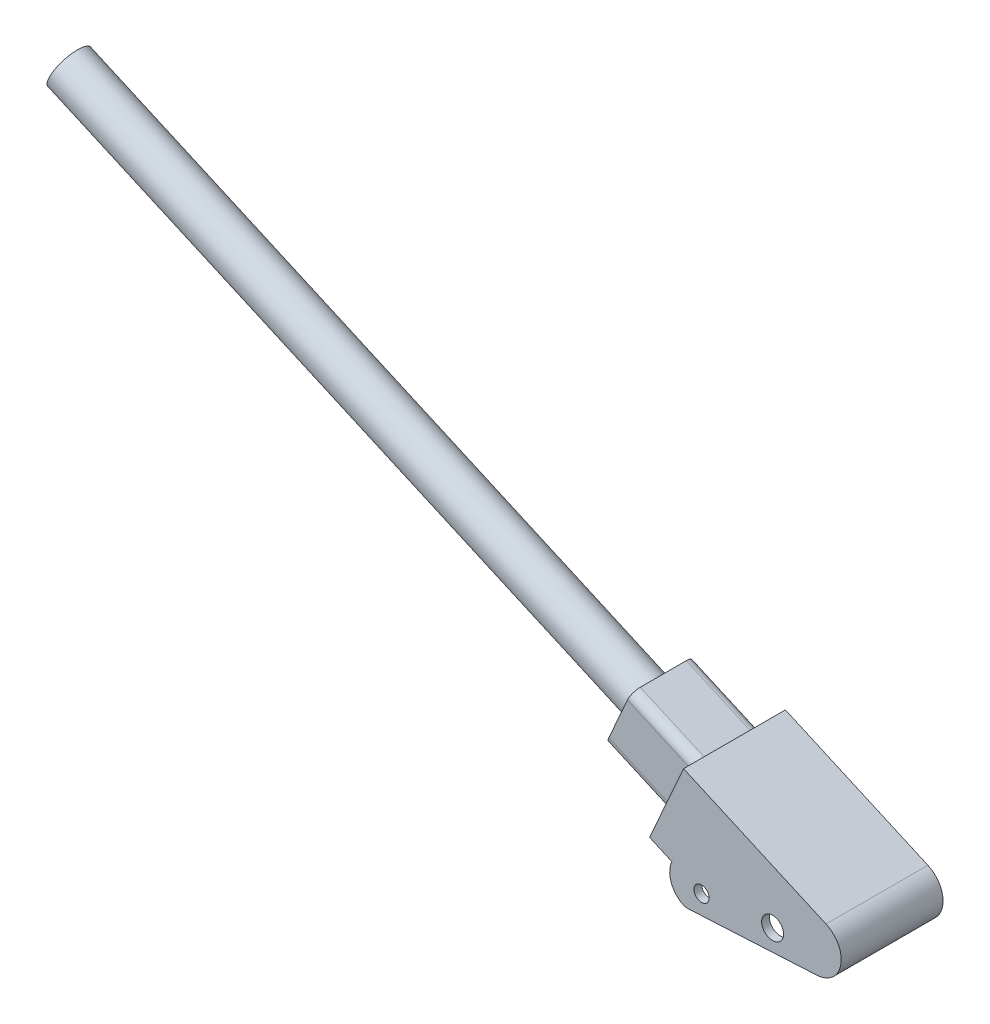
ISO-10303-21;
HEADER;
FILE_DESCRIPTION(('STEP AP214'),'2;1');
FILE_NAME('part.step','',(''),(''),'','','');
FILE_SCHEMA(('AUTOMOTIVE_DESIGN { 1 0 10303 214 1 1 1 1 }'));
ENDSEC;
DATA;
#1=APPLICATION_CONTEXT('core data for automotive mechanical design processes');
#2=APPLICATION_PROTOCOL_DEFINITION('international standard','automotive_design',2000,#1);
#3=PRODUCT_CONTEXT('',#1,'mechanical');
#4=PRODUCT('Part','Part','',(#3));
#5=PRODUCT_RELATED_PRODUCT_CATEGORY('part','',(#4));
#6=PRODUCT_DEFINITION_FORMATION('','',#4);
#7=PRODUCT_DEFINITION_CONTEXT('part definition',#1,'design');
#8=PRODUCT_DEFINITION('design','',#6,#7);
#9=PRODUCT_DEFINITION_SHAPE('','',#8);
#10=(LENGTH_UNIT() NAMED_UNIT(*) SI_UNIT(.MILLI.,.METRE.));
#11=(NAMED_UNIT(*) PLANE_ANGLE_UNIT() SI_UNIT($,.RADIAN.));
#12=(NAMED_UNIT(*) SI_UNIT($,.STERADIAN.) SOLID_ANGLE_UNIT());
#13=UNCERTAINTY_MEASURE_WITH_UNIT(LENGTH_MEASURE(1.E-05),#10,'distance_accuracy_value','');
#14=(GEOMETRIC_REPRESENTATION_CONTEXT(3) GLOBAL_UNCERTAINTY_ASSIGNED_CONTEXT((#13)) GLOBAL_UNIT_ASSIGNED_CONTEXT((#10,
#11,#12)) REPRESENTATION_CONTEXT('',''));
#15=CARTESIAN_POINT('',(0.,0.,0.));
#16=DIRECTION('',(0.,0.,1.));
#17=DIRECTION('',(1.,0.,0.));
#18=AXIS2_PLACEMENT_3D('',#15,#16,#17);
#19=CARTESIAN_POINT('',(-9.01965336816144,699.895781687176,-65.3737294305814));
#20=DIRECTION('',(0.406135243581549,0.913812980823186,0.));
#21=DIRECTION('',(-0.913812980823186,0.406135243581549,0.));
#22=AXIS2_PLACEMENT_3D('',#19,#20,#21);
#23=PLANE('',#22);
#24=DIRECTION('',(0.,0.,1.));
#25=VECTOR('',#24,1.);
#26=CARTESIAN_POINT('',(-9.01965336816149,699.895781687176,-65.3737294305814));
#27=LINE('',#26,#25);
#28=CARTESIAN_POINT('',(-9.01965336816179,699.895781687176,-5.42685815199663));
#29=VERTEX_POINT('',#28);
#30=CARTESIAN_POINT('',(-9.01965336816146,699.895781687176,-65.3737294305813));
#31=VERTEX_POINT('',#30);
#32=EDGE_CURVE('E170',#29,#31,#27,.F.);
#33=ORIENTED_EDGE('',*,*,#32,.T.);
#34=DIRECTION('',(0.913812980823186,-0.406135243581549,0.));
#35=VECTOR('',#34,1.);
#36=CARTESIAN_POINT('',(-9.01965336816144,699.895781687176,-65.3737294305813));
#37=LINE('',#36,#35);
#38=CARTESIAN_POINT('',(83.8038964876455,658.641262631392,-65.3737294305807));
#39=VERTEX_POINT('',#38);
#40=EDGE_CURVE('E306',#31,#39,#37,.T.);
#41=ORIENTED_EDGE('',*,*,#40,.T.);
#42=DIRECTION('',(0.,0.,1.));
#43=VECTOR('',#42,1.);
#44=CARTESIAN_POINT('',(83.8038964876453,658.641262631392,-65.3737294305807));
#45=LINE('',#44,#43);
#46=CARTESIAN_POINT('',(83.8038964876451,658.641262631392,-5.42685815199609));
#47=VERTEX_POINT('',#46);
#48=EDGE_CURVE('E162',#39,#47,#45,.T.);
#49=ORIENTED_EDGE('',*,*,#48,.T.);
#50=DIRECTION('',(0.913812980823186,-0.406135243581549,0.));
#51=VECTOR('',#50,1.);
#52=CARTESIAN_POINT('',(-9.01965336816178,699.895781687176,-5.42685815199661));
#53=LINE('',#52,#51);
#54=EDGE_CURVE('E182',#29,#47,#53,.T.);
#55=ORIENTED_EDGE('',*,*,#54,.F.);
#56=EDGE_LOOP('',(#33,#41,#49,#55));
#57=FACE_BOUND('',#56,.T.);
#58=ADVANCED_FACE('F17',(#57),#23,.F.);
#59=CARTESIAN_POINT('',(79.3680873572479,648.660597254841,-65.3737294305807));
#60=DIRECTION('',(0.,0.,1.));
#61=DIRECTION('',(1.,0.,0.));
#62=AXIS2_PLACEMENT_3D('',#59,#60,#61);
#63=CYLINDRICAL_SURFACE('',#62,10.9220000000002);
#64=ORIENTED_EDGE('',*,*,#48,.F.);
#65=CARTESIAN_POINT('',(79.3680873572479,648.660597254841,-65.3737294305808));
#66=DIRECTION('',(0.,0.,1.));
#67=DIRECTION('',(1.,0.,0.));
#68=AXIS2_PLACEMENT_3D('',#65,#66,#67);
#69=CIRCLE('',#68,10.9220000000002);
#70=CARTESIAN_POINT('',(90.2900873572481,648.660597254841,-65.3737294305807));
#71=VERTEX_POINT('',#70);
#72=EDGE_CURVE('E303',#39,#71,#69,.F.);
#73=ORIENTED_EDGE('',*,*,#72,.T.);
#74=DIRECTION('',(0.,0.,1.));
#75=VECTOR('',#74,1.);
#76=CARTESIAN_POINT('',(90.2900873572481,648.660597254841,-65.3737294305807));
#77=LINE('',#76,#75);
#78=CARTESIAN_POINT('',(90.2900873572479,648.660597254841,-5.42685815199604));
#79=VERTEX_POINT('',#78);
#80=EDGE_CURVE('E179',#71,#79,#77,.T.);
#81=ORIENTED_EDGE('',*,*,#80,.T.);
#82=CARTESIAN_POINT('',(79.3680873572475,648.660597254841,-5.42685815199611));
#83=DIRECTION('',(0.,0.,1.));
#84=DIRECTION('',(1.,0.,0.));
#85=AXIS2_PLACEMENT_3D('',#82,#83,#84);
#86=CIRCLE('',#85,10.9220000000002);
#87=EDGE_CURVE('E20',#47,#79,#86,.F.);
#88=ORIENTED_EDGE('',*,*,#87,.F.);
#89=EDGE_LOOP('',(#64,#73,#81,#88));
#90=FACE_BOUND('',#89,.T.);
#91=ADVANCED_FACE('F714',(#90),#63,.F.);
#92=CARTESIAN_POINT('',(-27.0950140159009,659.225833796656,-65.3737294305814));
#93=DIRECTION('',(-0.913812980823186,0.406135243581548,0.));
#94=DIRECTION('',(-0.406135243581548,-0.913812980823186,0.));
#95=AXIS2_PLACEMENT_3D('',#92,#93,#94);
#96=PLANE('',#95);
#97=DIRECTION('',(0.,0.,1.));
#98=VECTOR('',#97,1.);
#99=CARTESIAN_POINT('',(-27.0950140159009,659.225833796657,-65.3737294305814));
#100=LINE('',#99,#98);
#101=CARTESIAN_POINT('',(-27.0950140159013,659.225833796657,-5.42685815199659));
#102=VERTEX_POINT('',#101);
#103=CARTESIAN_POINT('',(-27.0950140159009,659.225833796657,-65.3737294305814));
#104=VERTEX_POINT('',#103);
#105=EDGE_CURVE('E329',#102,#104,#100,.F.);
#106=ORIENTED_EDGE('',*,*,#105,.T.);
#107=DIRECTION('',(0.406135243581548,0.913812980823186,0.));
#108=VECTOR('',#107,1.);
#109=CARTESIAN_POINT('',(-27.0950140159009,659.225833796656,-65.3737294305814));
#110=LINE('',#109,#108);
#111=EDGE_CURVE('E177',#104,#31,#110,.T.);
#112=ORIENTED_EDGE('',*,*,#111,.T.);
#113=ORIENTED_EDGE('',*,*,#32,.F.);
#114=DIRECTION('',(0.406135243581549,0.913812980823186,0.));
#115=VECTOR('',#114,1.);
#116=CARTESIAN_POINT('',(-27.0950140159013,659.225833796657,-5.4268581519967));
#117=LINE('',#116,#115);
#118=EDGE_CURVE('E174',#102,#29,#117,.T.);
#119=ORIENTED_EDGE('',*,*,#118,.F.);
#120=EDGE_LOOP('',(#106,#112,#113,#119));
#121=FACE_BOUND('',#120,.T.);
#122=ADVANCED_FACE('F172',(#121),#96,.F.);
#123=CARTESIAN_POINT('',(90.2900873572481,648.660597254841,-65.3737294305807));
#124=DIRECTION('',(1.,0.,0.));
#125=DIRECTION('',(0.,1.,0.));
#126=AXIS2_PLACEMENT_3D('',#123,#124,#125);
#127=PLANE('',#126);
#128=DIRECTION('',(0.,1.,0.));
#129=VECTOR('',#128,1.);
#130=CARTESIAN_POINT('',(90.2900873572478,649.836695259532,-5.42685815199597));
#131=LINE('',#130,#129);
#132=CARTESIAN_POINT('',(90.2900873572478,632.707669362922,-5.42685815199599));
#133=VERTEX_POINT('',#132);
#134=EDGE_CURVE('E315',#79,#133,#131,.F.);
#135=ORIENTED_EDGE('',*,*,#134,.F.);
#136=ORIENTED_EDGE('',*,*,#80,.F.);
#137=DIRECTION('',(0.,1.,0.));
#138=VECTOR('',#137,1.);
#139=CARTESIAN_POINT('',(90.2900873572481,649.836695259532,-65.3737294305807));
#140=LINE('',#139,#138);
#141=CARTESIAN_POINT('',(90.2900873572481,632.707669362922,-65.3737294305807));
#142=VERTEX_POINT('',#141);
#143=EDGE_CURVE('E305',#71,#142,#140,.F.);
#144=ORIENTED_EDGE('',*,*,#143,.T.);
#145=DIRECTION('',(0.,0.,-1.));
#146=VECTOR('',#145,1.);
#147=CARTESIAN_POINT('',(90.2900873572477,632.707669362922,5.89659792091371E-13));
#148=LINE('',#147,#146);
#149=EDGE_CURVE('E278',#133,#142,#148,.T.);
#150=ORIENTED_EDGE('',*,*,#149,.F.);
#151=EDGE_LOOP('',(#135,#136,#144,#150));
#152=FACE_BOUND('',#151,.T.);
#153=ADVANCED_FACE('F700',(#152),#127,.F.);
#154=CARTESIAN_POINT('',(0.,637.971544662078,0.));
#155=DIRECTION('',(0.,0.,-1.));
#156=DIRECTION('',(0.,1.,0.));
#157=AXIS2_PLACEMENT_3D('',#154,#155,#156);
#158=CYLINDRICAL_SURFACE('',#157,5.29336);
#159=CARTESIAN_POINT('',(0.,637.971544662078,-65.3737294305811));
#160=DIRECTION('',(0.,0.,-1.));
#161=DIRECTION('',(0.,1.,0.));
#162=AXIS2_PLACEMENT_3D('',#159,#160,#161);
#163=CIRCLE('',#162,5.29336);
#164=CARTESIAN_POINT('',(0.,643.264904662078,-65.3737294305811));
#165=VERTEX_POINT('',#164);
#166=EDGE_CURVE('E309',#165,#165,#163,.F.);
#167=ORIENTED_EDGE('',*,*,#166,.T.);
#168=EDGE_LOOP('',(#167));
#169=FACE_BOUND('',#168,.T.);
#170=CARTESIAN_POINT('',(0.,637.971544662078,-70.8005875825771));
#171=DIRECTION('',(0.,0.,-1.));
#172=DIRECTION('',(0.,1.,0.));
#173=AXIS2_PLACEMENT_3D('',#170,#171,#172);
#174=CIRCLE('',#173,5.29336);
#175=CARTESIAN_POINT('',(0.,643.264904662078,-70.8005875825771));
#176=VERTEX_POINT('',#175);
#177=EDGE_CURVE('E270',#176,#176,#174,.F.);
#178=ORIENTED_EDGE('',*,*,#177,.F.);
#179=EDGE_LOOP('',(#178));
#180=FACE_BOUND('',#179,.T.);
#181=ADVANCED_FACE('F692',(#169,#180),#158,.F.);
#182=CARTESIAN_POINT('',(49.4036598950758,642.072940425581,1.44382283906452E-12));
#183=DIRECTION('',(0.,0.,-1.));
#184=DIRECTION('',(-1.,0.,0.));
#185=AXIS2_PLACEMENT_3D('',#182,#183,#184);
#186=CYLINDRICAL_SURFACE('',#185,7.62);
#187=CARTESIAN_POINT('',(49.4036598950766,642.072940425581,-70.8005875825767));
#188=DIRECTION('',(0.,0.,-1.));
#189=DIRECTION('',(-1.,0.,0.));
#190=AXIS2_PLACEMENT_3D('',#187,#188,#189);
#191=CIRCLE('',#190,7.62);
#192=CARTESIAN_POINT('',(41.7836598950766,642.072940425581,-70.8005875825768));
#193=VERTEX_POINT('',#192);
#194=EDGE_CURVE('E267',#193,#193,#191,.F.);
#195=ORIENTED_EDGE('',*,*,#194,.F.);
#196=EDGE_LOOP('',(#195));
#197=FACE_BOUND('',#196,.T.);
#198=CARTESIAN_POINT('',(49.4036598950766,642.072940425581,-65.3737294305808));
#199=DIRECTION('',(0.,0.,-1.));
#200=DIRECTION('',(-1.,0.,0.));
#201=AXIS2_PLACEMENT_3D('',#198,#199,#200);
#202=CIRCLE('',#201,7.62);
#203=CARTESIAN_POINT('',(41.7836598950766,642.072940425581,-65.3737294305809));
#204=VERTEX_POINT('',#203);
#205=EDGE_CURVE('E307',#204,#204,#202,.F.);
#206=ORIENTED_EDGE('',*,*,#205,.T.);
#207=EDGE_LOOP('',(#206));
#208=FACE_BOUND('',#207,.T.);
#209=ADVANCED_FACE('F684',(#197,#208),#186,.F.);
#210=CARTESIAN_POINT('',(-9.91445800618713,630.578591642313,0.));
#211=DIRECTION('',(0.,0.,-1.));
#212=DIRECTION('',(-1.,0.,0.));
#213=AXIS2_PLACEMENT_3D('',#210,#211,#212);
#214=CYLINDRICAL_SURFACE('',#213,6.35000000000014);
#215=CARTESIAN_POINT('',(-9.91445800618671,630.578591642313,-70.8005875825774));
#216=DIRECTION('',(0.,0.,-1.));
#217=DIRECTION('',(-1.,0.,0.));
#218=AXIS2_PLACEMENT_3D('',#215,#216,#217);
#219=CIRCLE('',#218,6.35000000000014);
#220=CARTESIAN_POINT('',(-9.57971854778704,624.237420654633,-70.8005875825774));
#221=VERTEX_POINT('',#220);
#222=CARTESIAN_POINT('',(-12.6938613326272,624.869176860658,-70.8005875825774));
#223=VERTEX_POINT('',#222);
#224=EDGE_CURVE('E264',#221,#223,#219,.T.);
#225=ORIENTED_EDGE('',*,*,#224,.F.);
#226=DIRECTION('',(0.,0.,1.));
#227=VECTOR('',#226,1.);
#228=CARTESIAN_POINT('',(-9.57971854778699,624.237420654633,0.));
#229=LINE('',#228,#227);
#230=CARTESIAN_POINT('',(-9.57971854778705,624.237420654633,-65.3737294305813));
#231=VERTEX_POINT('',#230);
#232=EDGE_CURVE('E192',#231,#221,#229,.F.);
#233=ORIENTED_EDGE('',*,*,#232,.F.);
#234=CARTESIAN_POINT('',(-9.91445800618675,630.578591642313,-65.3737294305814));
#235=DIRECTION('',(0.,0.,-1.));
#236=DIRECTION('',(-1.,0.,0.));
#237=AXIS2_PLACEMENT_3D('',#234,#235,#236);
#238=CIRCLE('',#237,6.35000000000014);
#239=CARTESIAN_POINT('',(-12.6938613326272,624.869176860658,-65.3737294305814));
#240=VERTEX_POINT('',#239);
#241=EDGE_CURVE('E300',#231,#240,#238,.T.);
#242=ORIENTED_EDGE('',*,*,#241,.T.);
#243=DIRECTION('',(0.,0.,-1.));
#244=VECTOR('',#243,1.);
#245=CARTESIAN_POINT('',(-12.6938613326275,624.869176860658,0.));
#246=LINE('',#245,#244);
#247=EDGE_CURVE('E311',#223,#240,#246,.F.);
#248=ORIENTED_EDGE('',*,*,#247,.F.);
#249=EDGE_LOOP('',(#225,#233,#242,#248));
#250=FACE_BOUND('',#249,.T.);
#251=ADVANCED_FACE('F676',(#250),#214,.T.);
#252=CARTESIAN_POINT('',(-9.57971854778742,624.237420654633,0.));
#253=DIRECTION('',(0.052714875338522,-0.998609604359003,0.));
#254=DIRECTION('',(0.998609604359003,0.052714875338522,0.));
#255=AXIS2_PLACEMENT_3D('',#252,#253,#254);
#256=PLANE('',#255);
#257=DIRECTION('',(-0.998609604359003,-0.0527148753385221,0.));
#258=VECTOR('',#257,1.);
#259=CARTESIAN_POINT('',(80.3053578407677,628.982298508734,-70.8005875825768));
#260=LINE('',#259,#258);
#261=CARTESIAN_POINT('',(80.3053578407673,628.982298508734,-70.8005875825767));
#262=VERTEX_POINT('',#261);
#263=EDGE_CURVE('E261',#262,#221,#260,.T.);
#264=ORIENTED_EDGE('',*,*,#263,.F.);
#265=DIRECTION('',(0.,0.,-1.));
#266=VECTOR('',#265,1.);
#267=CARTESIAN_POINT('',(80.3053578407672,628.982298508734,5.26075361945318E-13));
#268=LINE('',#267,#266);
#269=CARTESIAN_POINT('',(80.3053578407672,628.982298508734,-65.3737294305808));
#270=VERTEX_POINT('',#269);
#271=EDGE_CURVE('E277',#270,#262,#268,.T.);
#272=ORIENTED_EDGE('',*,*,#271,.F.);
#273=DIRECTION('',(-0.998609604359003,-0.0527148753385221,0.));
#274=VECTOR('',#273,1.);
#275=CARTESIAN_POINT('',(80.3053578407676,628.982298508734,-65.3737294305807));
#276=LINE('',#275,#274);
#277=EDGE_CURVE('E302',#270,#231,#276,.T.);
#278=ORIENTED_EDGE('',*,*,#277,.T.);
#279=ORIENTED_EDGE('',*,*,#232,.T.);
#280=EDGE_LOOP('',(#264,#272,#278,#279));
#281=FACE_BOUND('',#280,.T.);
#282=ADVANCED_FACE('F669',(#281),#256,.T.);
#283=CARTESIAN_POINT('',(27.1453865764344,649.836695259532,-5.42685815199636));
#284=DIRECTION('',(0.,0.,-1.));
#285=DIRECTION('',(-1.,0.,0.));
#286=AXIS2_PLACEMENT_3D('',#283,#284,#285);
#287=PLANE('',#286);
#288=CARTESIAN_POINT('',(-9.9144580061871,630.578591642313,-5.42685815199661));
#289=DIRECTION('',(0.,0.,-1.));
#290=DIRECTION('',(-1.,0.,0.));
#291=AXIS2_PLACEMENT_3D('',#288,#289,#290);
#292=CIRCLE('',#291,6.35000000000014);
#293=CARTESIAN_POINT('',(-12.6938613326276,624.869176860658,-5.42685815199663));
#294=VERTEX_POINT('',#293);
#295=CARTESIAN_POINT('',(-9.57971854778745,624.237420654633,-5.42685815199658));
#296=VERTEX_POINT('',#295);
#297=EDGE_CURVE('E287',#294,#296,#292,.F.);
#298=ORIENTED_EDGE('',*,*,#297,.F.);
#299=CARTESIAN_POINT('',(-5.34579691209369,639.963476856648,-5.42685815199655));
#300=DIRECTION('',(0.,0.,-1.));
#301=DIRECTION('',(-1.,0.,0.));
#302=AXIS2_PLACEMENT_3D('',#299,#300,#301);
#303=CIRCLE('',#302,16.7878510565602);
#304=CARTESIAN_POINT('',(-20.623650860062,646.92186185906,-5.42685815199659));
#305=VERTEX_POINT('',#304);
#306=EDGE_CURVE('E283',#305,#294,#303,.F.);
#307=ORIENTED_EDGE('',*,*,#306,.F.);
#308=DIRECTION('',(0.913812980823184,-0.406135243581552,0.));
#309=VECTOR('',#308,1.);
#310=CARTESIAN_POINT('',(-36.1472189388689,653.821159894049,-5.42685815199654));
#311=LINE('',#310,#309);
#312=CARTESIAN_POINT('',(-27.0950140159011,649.797995933271,-5.42685815199654));
#313=VERTEX_POINT('',#312);
#314=EDGE_CURVE('E340',#313,#305,#311,.T.);
#315=ORIENTED_EDGE('',*,*,#314,.F.);
#316=DIRECTION('',(0.,1.,0.));
#317=VECTOR('',#316,1.);
#318=CARTESIAN_POINT('',(-27.0950140159011,619.887550238499,-5.42685815199654));
#319=LINE('',#318,#317);
#320=EDGE_CURVE('E190',#313,#102,#319,.T.);
#321=ORIENTED_EDGE('',*,*,#320,.T.);
#322=ORIENTED_EDGE('',*,*,#118,.T.);
#323=ORIENTED_EDGE('',*,*,#54,.T.);
#324=ORIENTED_EDGE('',*,*,#87,.T.);
#325=ORIENTED_EDGE('',*,*,#134,.T.);
#326=CARTESIAN_POINT('',(79.3680873572476,646.737577274238,-5.42685815199608));
#327=DIRECTION('',(0.,0.,-1.));
#328=DIRECTION('',(-1.,0.,0.));
#329=AXIS2_PLACEMENT_3D('',#326,#327,#328);
#330=CIRCLE('',#329,17.7800000000002);
#331=CARTESIAN_POINT('',(80.3053578407669,628.982298508734,-5.42685815199632));
#332=VERTEX_POINT('',#331);
#333=EDGE_CURVE('E279',#332,#133,#330,.F.);
#334=ORIENTED_EDGE('',*,*,#333,.F.);
#335=DIRECTION('',(0.998609604359003,0.052714875338522,0.));
#336=VECTOR('',#335,1.);
#337=CARTESIAN_POINT('',(-9.57971854778742,624.237420654633,-5.42685815199654));
#338=LINE('',#337,#336);
#339=EDGE_CURVE('E290',#296,#332,#338,.T.);
#340=ORIENTED_EDGE('',*,*,#339,.F.);
#341=EDGE_LOOP('',(#298,#307,#315,#321,#322,#323,#324,#325,#334,#340));
#342=FACE_BOUND('',#341,.T.);
#343=CARTESIAN_POINT('',(49.4036598950758,642.072940425581,-5.42685815199609));
#344=DIRECTION('',(0.,0.,-1.));
#345=DIRECTION('',(-1.,0.,0.));
#346=AXIS2_PLACEMENT_3D('',#343,#344,#345);
#347=CIRCLE('',#346,7.62);
#348=CARTESIAN_POINT('',(41.7836598950758,642.072940425581,-5.42685815199619));
#349=VERTEX_POINT('',#348);
#350=EDGE_CURVE('E291',#349,#349,#347,.F.);
#351=ORIENTED_EDGE('',*,*,#350,.T.);
#352=EDGE_LOOP('',(#351));
#353=FACE_BOUND('',#352,.T.);
#354=CARTESIAN_POINT('',(0.,637.971544662078,-5.42685815199636));
#355=DIRECTION('',(0.,0.,-1.));
#356=DIRECTION('',(0.,1.,0.));
#357=AXIS2_PLACEMENT_3D('',#354,#355,#356);
#358=CIRCLE('',#357,5.29336);
#359=CARTESIAN_POINT('',(0.,643.264904662078,-5.42685815199636));
#360=VERTEX_POINT('',#359);
#361=EDGE_CURVE('E294',#360,#360,#358,.F.);
#362=ORIENTED_EDGE('',*,*,#361,.T.);
#363=EDGE_LOOP('',(#362));
#364=FACE_BOUND('',#363,.T.);
#365=ADVANCED_FACE('F186',(#342,#353,#364),#287,.T.);
#366=CARTESIAN_POINT('',(-5.34579691209372,639.963476856648,0.));
#367=DIRECTION('',(0.,0.,-1.));
#368=DIRECTION('',(-1.,0.,0.));
#369=AXIS2_PLACEMENT_3D('',#366,#367,#368);
#370=CYLINDRICAL_SURFACE('',#369,16.7878510565602);
#371=CARTESIAN_POINT('',(-5.3457969120933,639.963476856648,-70.8005875825774));
#372=DIRECTION('',(0.,0.,-1.));
#373=DIRECTION('',(-1.,0.,0.));
#374=AXIS2_PLACEMENT_3D('',#371,#372,#373);
#375=CIRCLE('',#374,16.7878510565602);
#376=CARTESIAN_POINT('',(-20.6236508600616,646.92186185906,-70.8005875825774));
#377=VERTEX_POINT('',#376);
#378=EDGE_CURVE('E262',#223,#377,#375,.T.);
#379=ORIENTED_EDGE('',*,*,#378,.F.);
#380=ORIENTED_EDGE('',*,*,#247,.T.);
#381=CARTESIAN_POINT('',(-5.34579691209334,639.963476856648,-65.3737294305814));
#382=DIRECTION('',(0.,0.,-1.));
#383=DIRECTION('',(-1.,0.,0.));
#384=AXIS2_PLACEMENT_3D('',#381,#382,#383);
#385=CIRCLE('',#384,16.7878510565602);
#386=CARTESIAN_POINT('',(-20.6236508600616,646.92186185906,-65.3737294305814));
#387=VERTEX_POINT('',#386);
#388=EDGE_CURVE('E298',#240,#387,#385,.T.);
#389=ORIENTED_EDGE('',*,*,#388,.T.);
#390=DIRECTION('',(0.,0.,1.));
#391=VECTOR('',#390,1.);
#392=CARTESIAN_POINT('',(-20.6236508600617,646.92186185906,0.));
#393=LINE('',#392,#391);
#394=EDGE_CURVE('E349',#377,#387,#393,.T.);
#395=ORIENTED_EDGE('',*,*,#394,.F.);
#396=EDGE_LOOP('',(#379,#380,#389,#395));
#397=FACE_BOUND('',#396,.T.);
#398=ADVANCED_FACE('F655',(#397),#370,.T.);
#399=CARTESIAN_POINT('',(27.1453865764348,649.836695259532,-65.3737294305811));
#400=DIRECTION('',(0.,0.,-1.));
#401=DIRECTION('',(-1.,0.,0.));
#402=AXIS2_PLACEMENT_3D('',#399,#400,#401);
#403=PLANE('',#402);
#404=ORIENTED_EDGE('',*,*,#388,.F.);
#405=ORIENTED_EDGE('',*,*,#241,.F.);
#406=ORIENTED_EDGE('',*,*,#277,.F.);
#407=CARTESIAN_POINT('',(79.3680873572479,646.737577274238,-65.3737294305808));
#408=DIRECTION('',(0.,0.,-1.));
#409=DIRECTION('',(-1.,0.,0.));
#410=AXIS2_PLACEMENT_3D('',#407,#408,#409);
#411=CIRCLE('',#410,17.7800000000002);
#412=EDGE_CURVE('E274',#142,#270,#411,.T.);
#413=ORIENTED_EDGE('',*,*,#412,.F.);
#414=ORIENTED_EDGE('',*,*,#143,.F.);
#415=ORIENTED_EDGE('',*,*,#72,.F.);
#416=ORIENTED_EDGE('',*,*,#40,.F.);
#417=ORIENTED_EDGE('',*,*,#111,.F.);
#418=DIRECTION('',(0.,1.,0.));
#419=VECTOR('',#418,1.);
#420=CARTESIAN_POINT('',(-27.0950140159008,619.887550238499,-65.3737294305814));
#421=LINE('',#420,#419);
#422=CARTESIAN_POINT('',(-27.0950140159009,649.797995933271,-65.3737294305814));
#423=VERTEX_POINT('',#422);
#424=EDGE_CURVE('E297',#104,#423,#421,.F.);
#425=ORIENTED_EDGE('',*,*,#424,.T.);
#426=DIRECTION('',(0.913812980823184,-0.406135243581552,0.));
#427=VECTOR('',#426,1.);
#428=CARTESIAN_POINT('',(-36.1472189388688,653.82115989405,-65.3737294305814));
#429=LINE('',#428,#427);
#430=EDGE_CURVE('E356',#387,#423,#429,.F.);
#431=ORIENTED_EDGE('',*,*,#430,.F.);
#432=EDGE_LOOP('',(#404,#405,#406,#413,#414,#415,#416,#417,#425,#431));
#433=FACE_BOUND('',#432,.T.);
#434=ORIENTED_EDGE('',*,*,#205,.F.);
#435=EDGE_LOOP('',(#434));
#436=FACE_BOUND('',#435,.T.);
#437=ORIENTED_EDGE('',*,*,#166,.F.);
#438=EDGE_LOOP('',(#437));
#439=FACE_BOUND('',#438,.T.);
#440=ADVANCED_FACE('F647',(#433,#436,#439),#403,.F.);
#441=CARTESIAN_POINT('',(-27.0950140159008,619.887550238499,-65.3737294305814));
#442=DIRECTION('',(-1.,0.,0.));
#443=DIRECTION('',(0.,0.,1.));
#444=AXIS2_PLACEMENT_3D('',#441,#442,#443);
#445=PLANE('',#444);
#446=ORIENTED_EDGE('',*,*,#424,.F.);
#447=ORIENTED_EDGE('',*,*,#105,.F.);
#448=ORIENTED_EDGE('',*,*,#320,.F.);
#449=DIRECTION('',(0.,0.,1.));
#450=VECTOR('',#449,1.);
#451=CARTESIAN_POINT('',(-27.095014015901,649.797995933271,0.));
#452=LINE('',#451,#450);
#453=EDGE_CURVE('E257',#423,#313,#452,.T.);
#454=ORIENTED_EDGE('',*,*,#453,.F.);
#455=EDGE_LOOP('',(#446,#447,#448,#454));
#456=FACE_BOUND('',#455,.T.);
#457=ADVANCED_FACE('F639',(#456),#445,.F.);
#458=CARTESIAN_POINT('',(0.,637.971544662078,0.));
#459=DIRECTION('',(0.,0.,-1.));
#460=DIRECTION('',(0.,1.,0.));
#461=AXIS2_PLACEMENT_3D('',#458,#459,#460);
#462=CYLINDRICAL_SURFACE('',#461,5.29336);
#463=ORIENTED_EDGE('',*,*,#361,.F.);
#464=EDGE_LOOP('',(#463));
#465=FACE_BOUND('',#464,.T.);
#466=CARTESIAN_POINT('',(0.,637.971544662078,0.));
#467=DIRECTION('',(0.,0.,-1.));
#468=DIRECTION('',(0.,1.,0.));
#469=AXIS2_PLACEMENT_3D('',#466,#467,#468);
#470=CIRCLE('',#469,5.29336);
#471=CARTESIAN_POINT('',(0.,643.264904662078,0.));
#472=VERTEX_POINT('',#471);
#473=EDGE_CURVE('E254',#472,#472,#470,.F.);
#474=ORIENTED_EDGE('',*,*,#473,.T.);
#475=EDGE_LOOP('',(#474));
#476=FACE_BOUND('',#475,.T.);
#477=ADVANCED_FACE('F631',(#465,#476),#462,.F.);
#478=CARTESIAN_POINT('',(49.4036598950758,642.072940425581,1.44382283906452E-12));
#479=DIRECTION('',(0.,0.,-1.));
#480=DIRECTION('',(-1.,0.,0.));
#481=AXIS2_PLACEMENT_3D('',#478,#479,#480);
#482=CYLINDRICAL_SURFACE('',#481,7.62);
#483=ORIENTED_EDGE('',*,*,#350,.F.);
#484=EDGE_LOOP('',(#483));
#485=FACE_BOUND('',#484,.T.);
#486=CARTESIAN_POINT('',(49.4036598950758,642.072940425581,1.4473207033211E-12));
#487=DIRECTION('',(0.,0.,-1.));
#488=DIRECTION('',(-1.,0.,0.));
#489=AXIS2_PLACEMENT_3D('',#486,#487,#488);
#490=CIRCLE('',#489,7.62);
#491=CARTESIAN_POINT('',(41.7836598950758,642.072940425581,1.35358391162299E-12));
#492=VERTEX_POINT('',#491);
#493=EDGE_CURVE('E251',#492,#492,#490,.F.);
#494=ORIENTED_EDGE('',*,*,#493,.T.);
#495=EDGE_LOOP('',(#494));
#496=FACE_BOUND('',#495,.T.);
#497=ADVANCED_FACE('F623',(#485,#496),#482,.F.);
#498=CARTESIAN_POINT('',(-9.57971854778742,624.237420654633,0.));
#499=DIRECTION('',(0.052714875338522,-0.998609604359003,0.));
#500=DIRECTION('',(0.998609604359003,0.052714875338522,0.));
#501=AXIS2_PLACEMENT_3D('',#498,#499,#500);
#502=PLANE('',#501);
#503=DIRECTION('',(-0.998609604359003,-0.0527148753385221,0.));
#504=VECTOR('',#503,1.);
#505=CARTESIAN_POINT('',(80.3053578407672,628.982298508734,6.60413158718996E-13));
#506=LINE('',#505,#504);
#507=CARTESIAN_POINT('',(80.3053578407669,628.982298508734,6.07388545387557E-13));
#508=VERTEX_POINT('',#507);
#509=CARTESIAN_POINT('',(-9.57971854778748,624.237420654633,1.00058574358079E-13));
#510=VERTEX_POINT('',#509);
#511=EDGE_CURVE('E246',#508,#510,#506,.T.);
#512=ORIENTED_EDGE('',*,*,#511,.T.);
#513=DIRECTION('',(0.,0.,-1.));
#514=VECTOR('',#513,1.);
#515=CARTESIAN_POINT('',(-9.57971854778746,624.237420654633,0.));
#516=LINE('',#515,#514);
#517=EDGE_CURVE('E286',#296,#510,#516,.F.);
#518=ORIENTED_EDGE('',*,*,#517,.F.);
#519=ORIENTED_EDGE('',*,*,#339,.T.);
#520=DIRECTION('',(0.,0.,-1.));
#521=VECTOR('',#520,1.);
#522=CARTESIAN_POINT('',(80.3053578407672,628.982298508734,5.26075361945318E-13));
#523=LINE('',#522,#521);
#524=EDGE_CURVE('E273',#508,#332,#523,.T.);
#525=ORIENTED_EDGE('',*,*,#524,.F.);
#526=EDGE_LOOP('',(#512,#518,#519,#525));
#527=FACE_BOUND('',#526,.T.);
#528=ADVANCED_FACE('F615',(#527),#502,.T.);
#529=CARTESIAN_POINT('',(-9.91445800618713,630.578591642313,0.));
#530=DIRECTION('',(0.,0.,-1.));
#531=DIRECTION('',(-1.,0.,0.));
#532=AXIS2_PLACEMENT_3D('',#529,#530,#531);
#533=CYLINDRICAL_SURFACE('',#532,6.35000000000014);
#534=CARTESIAN_POINT('',(-9.91445800618713,630.578591642313,0.));
#535=DIRECTION('',(0.,0.,-1.));
#536=DIRECTION('',(-1.,0.,0.));
#537=AXIS2_PLACEMENT_3D('',#534,#535,#536);
#538=CIRCLE('',#537,6.35000000000014);
#539=CARTESIAN_POINT('',(-12.6938613326276,624.869176860658,0.));
#540=VERTEX_POINT('',#539);
#541=EDGE_CURVE('E244',#510,#540,#538,.T.);
#542=ORIENTED_EDGE('',*,*,#541,.T.);
#543=DIRECTION('',(0.,0.,-1.));
#544=VECTOR('',#543,1.);
#545=CARTESIAN_POINT('',(-12.6938613326275,624.869176860658,0.));
#546=LINE('',#545,#544);
#547=EDGE_CURVE('E282',#294,#540,#546,.F.);
#548=ORIENTED_EDGE('',*,*,#547,.F.);
#549=ORIENTED_EDGE('',*,*,#297,.T.);
#550=ORIENTED_EDGE('',*,*,#517,.T.);
#551=EDGE_LOOP('',(#542,#548,#549,#550));
#552=FACE_BOUND('',#551,.T.);
#553=ADVANCED_FACE('F607',(#552),#533,.T.);
#554=CARTESIAN_POINT('',(-5.34579691209372,639.963476856648,0.));
#555=DIRECTION('',(0.,0.,-1.));
#556=DIRECTION('',(-1.,0.,0.));
#557=AXIS2_PLACEMENT_3D('',#554,#555,#556);
#558=CYLINDRICAL_SURFACE('',#557,16.7878510565602);
#559=CARTESIAN_POINT('',(-5.34579691209372,639.963476856648,1.5158357293977E-13));
#560=DIRECTION('',(0.,0.,-1.));
#561=DIRECTION('',(-1.,0.,0.));
#562=AXIS2_PLACEMENT_3D('',#559,#560,#561);
#563=CIRCLE('',#562,16.7878510565602);
#564=CARTESIAN_POINT('',(-20.623650860062,646.92186185906,0.));
#565=VERTEX_POINT('',#564);
#566=EDGE_CURVE('E240',#540,#565,#563,.T.);
#567=ORIENTED_EDGE('',*,*,#566,.T.);
#568=DIRECTION('',(0.,0.,1.));
#569=VECTOR('',#568,1.);
#570=CARTESIAN_POINT('',(-20.6236508600621,646.92186185906,0.));
#571=LINE('',#570,#569);
#572=EDGE_CURVE('E343',#305,#565,#571,.T.);
#573=ORIENTED_EDGE('',*,*,#572,.F.);
#574=ORIENTED_EDGE('',*,*,#306,.T.);
#575=ORIENTED_EDGE('',*,*,#547,.T.);
#576=EDGE_LOOP('',(#567,#573,#574,#575));
#577=FACE_BOUND('',#576,.T.);
#578=ADVANCED_FACE('F599',(#577),#558,.T.);
#579=CARTESIAN_POINT('',(79.3680873572475,646.737577274238,5.41433564649196E-13));
#580=DIRECTION('',(0.,0.,-1.));
#581=DIRECTION('',(-1.,0.,0.));
#582=AXIS2_PLACEMENT_3D('',#579,#580,#581);
#583=CYLINDRICAL_SURFACE('',#582,17.7800000000002);
#584=CARTESIAN_POINT('',(79.3680873572475,646.737577274238,5.69722134760001E-13));
#585=DIRECTION('',(0.,0.,-1.));
#586=DIRECTION('',(-1.,0.,0.));
#587=AXIS2_PLACEMENT_3D('',#584,#585,#586);
#588=CIRCLE('',#587,17.7800000000002);
#589=CARTESIAN_POINT('',(86.5891719881273,662.985172073274,4.51194637207665E-13));
#590=VERTEX_POINT('',#589);
#591=EDGE_CURVE('E247',#590,#508,#588,.T.);
#592=ORIENTED_EDGE('',*,*,#591,.T.);
#593=ORIENTED_EDGE('',*,*,#524,.T.);
#594=ORIENTED_EDGE('',*,*,#333,.T.);
#595=ORIENTED_EDGE('',*,*,#149,.T.);
#596=ORIENTED_EDGE('',*,*,#412,.T.);
#597=ORIENTED_EDGE('',*,*,#271,.T.);
#598=CARTESIAN_POINT('',(79.368087357248,646.737577274238,-70.8005875825767));
#599=DIRECTION('',(0.,0.,-1.));
#600=DIRECTION('',(-1.,0.,0.));
#601=AXIS2_PLACEMENT_3D('',#598,#599,#600);
#602=CIRCLE('',#601,17.7800000000002);
#603=CARTESIAN_POINT('',(86.5891719881275,662.985172073274,-70.8005875825767));
#604=VERTEX_POINT('',#603);
#605=EDGE_CURVE('E258',#604,#262,#602,.T.);
#606=ORIENTED_EDGE('',*,*,#605,.F.);
#607=DIRECTION('',(0.,0.,1.));
#608=VECTOR('',#607,1.);
#609=CARTESIAN_POINT('',(86.589171988127,662.985172073274,6.31672492090729E-13));
#610=LINE('',#609,#608);
#611=EDGE_CURVE('E387',#590,#604,#610,.F.);
#612=ORIENTED_EDGE('',*,*,#611,.F.);
#613=EDGE_LOOP('',(#592,#593,#594,#595,#596,#597,#606,#612));
#614=FACE_BOUND('',#613,.T.);
#615=ADVANCED_FACE('F591',(#614),#583,.T.);
#616=CARTESIAN_POINT('',(25.970078188056,657.810953288423,-70.8005875825771));
#617=DIRECTION('',(0.,0.,-1.));
#618=DIRECTION('',(-1.,0.,0.));
#619=AXIS2_PLACEMENT_3D('',#616,#617,#618);
#620=PLANE('',#619);
#621=ORIENTED_EDGE('',*,*,#605,.T.);
#622=ORIENTED_EDGE('',*,*,#263,.T.);
#623=ORIENTED_EDGE('',*,*,#224,.T.);
#624=ORIENTED_EDGE('',*,*,#378,.T.);
#625=DIRECTION('',(0.913812980823184,-0.406135243581552,0.));
#626=VECTOR('',#625,1.);
#627=CARTESIAN_POINT('',(-36.1472189388688,653.82115989405,-70.8005875825774));
#628=LINE('',#627,#626);
#629=CARTESIAN_POINT('',(-36.1472189388685,653.82115989405,-70.8005875825775));
#630=VERTEX_POINT('',#629);
#631=EDGE_CURVE('E346',#630,#377,#628,.T.);
#632=ORIENTED_EDGE('',*,*,#631,.F.);
#633=DIRECTION('',(-0.406135243581549,-0.913812980823186,0.));
#634=VECTOR('',#633,1.);
#635=CARTESIAN_POINT('',(-12.5013072901646,707.02496662954,-70.8005875825775));
#636=LINE('',#635,#634);
#637=CARTESIAN_POINT('',(-12.5013072901646,707.02496662954,-70.800587582577));
#638=VERTEX_POINT('',#637);
#639=EDGE_CURVE('E375',#638,#630,#636,.T.);
#640=ORIENTED_EDGE('',*,*,#639,.F.);
#641=DIRECTION('',(-0.913812980823185,0.40613524358155,0.));
#642=VECTOR('',#641,1.);
#643=CARTESIAN_POINT('',(86.5891719881271,662.985172073274,-70.8005875825767));
#644=LINE('',#643,#642);
#645=EDGE_CURVE('E243',#604,#638,#644,.T.);
#646=ORIENTED_EDGE('',*,*,#645,.F.);
#647=EDGE_LOOP('',(#621,#622,#623,#624,#632,#640,#646));
#648=FACE_BOUND('',#647,.T.);
#649=ORIENTED_EDGE('',*,*,#194,.T.);
#650=EDGE_LOOP('',(#649));
#651=FACE_BOUND('',#650,.T.);
#652=ORIENTED_EDGE('',*,*,#177,.T.);
#653=EDGE_LOOP('',(#652));
#654=FACE_BOUND('',#653,.T.);
#655=ADVANCED_FACE('F583',(#648,#651,#654),#620,.T.);
#656=CARTESIAN_POINT('',(-36.1472189388689,653.821159894049,0.));
#657=DIRECTION('',(-0.406135243581552,-0.913812980823184,0.));
#658=DIRECTION('',(0.913812980823184,-0.406135243581552,0.));
#659=AXIS2_PLACEMENT_3D('',#656,#657,#658);
#660=PLANE('',#659);
#661=ORIENTED_EDGE('',*,*,#430,.T.);
#662=ORIENTED_EDGE('',*,*,#453,.T.);
#663=ORIENTED_EDGE('',*,*,#314,.T.);
#664=ORIENTED_EDGE('',*,*,#572,.T.);
#665=DIRECTION('',(-0.913812980823189,0.406135243581541,0.));
#666=VECTOR('',#665,1.);
#667=CARTESIAN_POINT('',(-20.623650860062,646.92186185906,0.));
#668=LINE('',#667,#666);
#669=CARTESIAN_POINT('',(-36.1472189388689,653.82115989405,0.));
#670=VERTEX_POINT('',#669);
#671=EDGE_CURVE('E250',#565,#670,#668,.T.);
#672=ORIENTED_EDGE('',*,*,#671,.T.);
#673=DIRECTION('',(0.,0.,1.));
#674=VECTOR('',#673,1.);
#675=CARTESIAN_POINT('',(-36.1472189388688,653.82115989405,2.70716782324598E-13));
#676=LINE('',#675,#674);
#677=EDGE_CURVE('E371',#630,#670,#676,.T.);
#678=ORIENTED_EDGE('',*,*,#677,.F.);
#679=ORIENTED_EDGE('',*,*,#631,.T.);
#680=ORIENTED_EDGE('',*,*,#394,.T.);
#681=EDGE_LOOP('',(#661,#662,#663,#664,#672,#678,#679,#680));
#682=FACE_BOUND('',#681,.T.);
#683=ADVANCED_FACE('F575',(#682),#660,.T.);
#684=CARTESIAN_POINT('',(25.9700781880556,657.810953288423,3.60955709766131E-13));
#685=DIRECTION('',(0.,0.,-1.));
#686=DIRECTION('',(-1.,0.,0.));
#687=AXIS2_PLACEMENT_3D('',#684,#685,#686);
#688=PLANE('',#687);
#689=ORIENTED_EDGE('',*,*,#541,.F.);
#690=ORIENTED_EDGE('',*,*,#511,.F.);
#691=ORIENTED_EDGE('',*,*,#591,.F.);
#692=DIRECTION('',(-0.913812980823185,0.40613524358155,0.));
#693=VECTOR('',#692,1.);
#694=CARTESIAN_POINT('',(86.589171988127,662.985172073274,2.70716782324598E-13));
#695=LINE('',#694,#693);
#696=CARTESIAN_POINT('',(-12.5013072901649,707.02496662954,2.70716782324598E-13));
#697=VERTEX_POINT('',#696);
#698=EDGE_CURVE('E392',#697,#590,#695,.F.);
#699=ORIENTED_EDGE('',*,*,#698,.F.);
#700=DIRECTION('',(-0.406135243581549,-0.913812980823186,0.));
#701=VECTOR('',#700,1.);
#702=CARTESIAN_POINT('',(-12.5013072901649,707.02496662954,0.));
#703=LINE('',#702,#701);
#704=EDGE_CURVE('E374',#670,#697,#703,.F.);
#705=ORIENTED_EDGE('',*,*,#704,.F.);
#706=ORIENTED_EDGE('',*,*,#671,.F.);
#707=ORIENTED_EDGE('',*,*,#566,.F.);
#708=EDGE_LOOP('',(#689,#690,#691,#699,#705,#706,#707));
#709=FACE_BOUND('',#708,.T.);
#710=ORIENTED_EDGE('',*,*,#493,.F.);
#711=EDGE_LOOP('',(#710));
#712=FACE_BOUND('',#711,.T.);
#713=ORIENTED_EDGE('',*,*,#473,.F.);
#714=EDGE_LOOP('',(#713));
#715=FACE_BOUND('',#714,.T.);
#716=ADVANCED_FACE('F567',(#709,#712,#715),#688,.F.);
#717=CARTESIAN_POINT('',(86.589171988127,662.985172073274,6.31672492090729E-13));
#718=DIRECTION('',(0.40613524358155,0.913812980823185,0.));
#719=DIRECTION('',(-0.913812980823185,0.40613524358155,0.));
#720=AXIS2_PLACEMENT_3D('',#717,#718,#719);
#721=PLANE('',#720);
#722=ORIENTED_EDGE('',*,*,#698,.T.);
#723=ORIENTED_EDGE('',*,*,#611,.T.);
#724=ORIENTED_EDGE('',*,*,#645,.T.);
#725=DIRECTION('',(0.,0.,1.));
#726=VECTOR('',#725,1.);
#727=CARTESIAN_POINT('',(-12.5013072901649,707.02496662954,2.70716782324598E-13));
#728=LINE('',#727,#726);
#729=EDGE_CURVE('E397',#697,#638,#728,.F.);
#730=ORIENTED_EDGE('',*,*,#729,.F.);
#731=EDGE_LOOP('',(#722,#723,#724,#730));
#732=FACE_BOUND('',#731,.T.);
#733=ADVANCED_FACE('F486',(#732),#721,.T.);
#734=CARTESIAN_POINT('',(-12.5013072901649,707.02496662954,2.70716782324598E-13));
#735=DIRECTION('',(-0.913812980823186,0.406135243581549,0.));
#736=DIRECTION('',(-0.406135243581549,-0.913812980823186,0.));
#737=AXIS2_PLACEMENT_3D('',#734,#735,#736);
#738=PLANE('',#737);
#739=DIRECTION('',(0.,0.,1.));
#740=VECTOR('',#739,1.);
#741=CARTESIAN_POINT('',(-33.3836080069938,660.039343574001,-35.4002937912891));
#742=LINE('',#741,#740);
#743=CARTESIAN_POINT('',(-33.3836080069939,660.039343574001,-51.3565206840489));
#744=VERTEX_POINT('',#743);
#745=CARTESIAN_POINT('',(-33.3836080069939,660.039343574001,-19.4440668985263));
#746=VERTEX_POINT('',#745);
#747=EDGE_CURVE('E422',#744,#746,#742,.T.);
#748=ORIENTED_EDGE('',*,*,#747,.F.);
#749=CARTESIAN_POINT('',(-30.8046492102512,665.842056002228,-51.356520684049));
#750=DIRECTION('',(0.913812980823183,-0.406135243581556,0.));
#751=DIRECTION('',(0.406135243581556,0.913812980823183,0.));
#752=AXIS2_PLACEMENT_3D('',#749,#750,#751);
#753=CIRCLE('',#752,6.35);
#754=CARTESIAN_POINT('',(-30.8046492102512,665.842056002228,-57.7065206840489));
#755=VERTEX_POINT('',#754);
#756=EDGE_CURVE('E220',#755,#744,#753,.F.);
#757=ORIENTED_EDGE('',*,*,#756,.F.);
#758=DIRECTION('',(-0.406135243581547,-0.913812980823187,0.));
#759=VECTOR('',#758,1.);
#760=CARTESIAN_POINT('',(-17.8438770187824,695.00407052136,-57.7065206840491));
#761=LINE('',#760,#759);
#762=CARTESIAN_POINT('',(-17.8438770187823,695.00407052136,-57.706520684049));
#763=VERTEX_POINT('',#762);
#764=EDGE_CURVE('E239',#763,#755,#761,.T.);
#765=ORIENTED_EDGE('',*,*,#764,.F.);
#766=CARTESIAN_POINT('',(-17.8438770187823,695.00407052136,-51.3565206840488));
#767=DIRECTION('',(0.913812980823185,-0.406135243581551,0.));
#768=DIRECTION('',(0.406135243581551,0.913812980823185,0.));
#769=AXIS2_PLACEMENT_3D('',#766,#767,#768);
#770=CIRCLE('',#769,6.35);
#771=CARTESIAN_POINT('',(-15.2649182220395,700.806782949587,-51.356520684049));
#772=VERTEX_POINT('',#771);
#773=EDGE_CURVE('E235',#772,#763,#770,.F.);
#774=ORIENTED_EDGE('',*,*,#773,.F.);
#775=DIRECTION('',(0.,0.,1.));
#776=VECTOR('',#775,1.);
#777=CARTESIAN_POINT('',(-15.2649182220396,700.806782949588,-35.4002937912887));
#778=LINE('',#777,#776);
#779=CARTESIAN_POINT('',(-15.2649182220396,700.806782949588,-19.4440668985263));
#780=VERTEX_POINT('',#779);
#781=EDGE_CURVE('E415',#780,#772,#778,.F.);
#782=ORIENTED_EDGE('',*,*,#781,.F.);
#783=CARTESIAN_POINT('',(-17.8438770187823,695.004070521361,-19.4440668985263));
#784=DIRECTION('',(0.91381298082319,-0.40613524358154,0.));
#785=DIRECTION('',(0.40613524358154,0.91381298082319,0.));
#786=AXIS2_PLACEMENT_3D('',#783,#784,#785);
#787=CIRCLE('',#786,6.35);
#788=CARTESIAN_POINT('',(-17.8438770187825,695.004070521361,-13.0940668985266));
#789=VERTEX_POINT('',#788);
#790=EDGE_CURVE('E230',#789,#780,#787,.F.);
#791=ORIENTED_EDGE('',*,*,#790,.F.);
#792=DIRECTION('',(0.406135243581546,0.913812980823187,0.));
#793=VECTOR('',#792,1.);
#794=CARTESIAN_POINT('',(-30.8046492102511,665.842056002229,-13.0940668985261));
#795=LINE('',#794,#793);
#796=CARTESIAN_POINT('',(-30.8046492102512,665.842056002229,-13.0940668985261));
#797=VERTEX_POINT('',#796);
#798=EDGE_CURVE('E418',#797,#789,#795,.T.);
#799=ORIENTED_EDGE('',*,*,#798,.F.);
#800=CARTESIAN_POINT('',(-30.8046492102512,665.842056002228,-19.4440668985261));
#801=DIRECTION('',(0.913812980823184,-0.406135243581553,0.));
#802=DIRECTION('',(0.406135243581553,0.913812980823184,0.));
#803=AXIS2_PLACEMENT_3D('',#800,#801,#802);
#804=CIRCLE('',#803,6.35);
#805=EDGE_CURVE('E225',#746,#797,#804,.F.);
#806=ORIENTED_EDGE('',*,*,#805,.F.);
#807=EDGE_LOOP('',(#748,#757,#765,#774,#782,#791,#799,#806));
#808=FACE_BOUND('',#807,.T.);
#809=ORIENTED_EDGE('',*,*,#704,.T.);
#810=ORIENTED_EDGE('',*,*,#729,.T.);
#811=ORIENTED_EDGE('',*,*,#639,.T.);
#812=ORIENTED_EDGE('',*,*,#677,.T.);
#813=EDGE_LOOP('',(#809,#810,#811,#812));
#814=FACE_BOUND('',#813,.T.);
#815=ADVANCED_FACE('F464',(#808,#814),#738,.T.);
#816=CARTESIAN_POINT('',(-71.070804947362,701.19910666706,-57.7065206840493));
#817=DIRECTION('',(0.,0.,-1.));
#818=DIRECTION('',(0.,1.,0.));
#819=AXIS2_PLACEMENT_3D('',#816,#817,#818);
#820=PLANE('',#819);
#821=DIRECTION('',(0.913812980823185,-0.406135243581551,0.));
#822=VECTOR('',#821,1.);
#823=CARTESIAN_POINT('',(-64.5904188516276,715.780113926626,-57.7065206840493));
#824=LINE('',#823,#822);
#825=CARTESIAN_POINT('',(-64.5904188516278,715.780113926626,-57.7065206840493));
#826=VERTEX_POINT('',#825);
#827=EDGE_CURVE('E238',#763,#826,#824,.F.);
#828=ORIENTED_EDGE('',*,*,#827,.F.);
#829=ORIENTED_EDGE('',*,*,#764,.T.);
#830=DIRECTION('',(0.913812980823183,-0.406135243581556,0.));
#831=VECTOR('',#830,1.);
#832=CARTESIAN_POINT('',(-77.5511910430965,686.618099407494,-57.7065206840489));
#833=LINE('',#832,#831);
#834=CARTESIAN_POINT('',(-77.5511910430963,686.618099407494,-57.7065206840491));
#835=VERTEX_POINT('',#834);
#836=EDGE_CURVE('E224',#835,#755,#833,.T.);
#837=ORIENTED_EDGE('',*,*,#836,.F.);
#838=DIRECTION('',(0.406135243581548,0.913812980823186,0.));
#839=VECTOR('',#838,1.);
#840=CARTESIAN_POINT('',(-71.0708049473619,701.19910666706,-57.7065206840493));
#841=LINE('',#840,#839);
#842=EDGE_CURVE('E219',#835,#826,#841,.T.);
#843=ORIENTED_EDGE('',*,*,#842,.T.);
#844=EDGE_LOOP('',(#828,#829,#837,#843));
#845=FACE_BOUND('',#844,.T.);
#846=ADVANCED_FACE('F477',(#845),#820,.T.);
#847=CARTESIAN_POINT('',(-64.5904188516277,715.780113926626,-51.3565206840493));
#848=DIRECTION('',(0.913812980823185,-0.406135243581551,0.));
#849=DIRECTION('',(0.406135243581551,0.913812980823185,0.));
#850=AXIS2_PLACEMENT_3D('',#847,#848,#849);
#851=CYLINDRICAL_SURFACE('',#850,6.35);
#852=ORIENTED_EDGE('',*,*,#773,.T.);
#853=ORIENTED_EDGE('',*,*,#827,.T.);
#854=CARTESIAN_POINT('',(-64.5904188516279,715.780113926626,-51.3565206840493));
#855=DIRECTION('',(0.913812980823185,-0.406135243581551,0.));
#856=DIRECTION('',(0.406135243581551,0.913812980823185,0.));
#857=AXIS2_PLACEMENT_3D('',#854,#855,#856);
#858=CIRCLE('',#857,6.35);
#859=CARTESIAN_POINT('',(-62.011460054885,721.582826354853,-51.3565206840492));
#860=VERTEX_POINT('',#859);
#861=EDGE_CURVE('E217',#826,#860,#858,.T.);
#862=ORIENTED_EDGE('',*,*,#861,.T.);
#863=DIRECTION('',(-0.913812980823186,0.406135243581548,0.));
#864=VECTOR('',#863,1.);
#865=CARTESIAN_POINT('',(-62.0114600548849,721.582826354853,-51.3565206840491));
#866=LINE('',#865,#864);
#867=EDGE_CURVE('E234',#772,#860,#866,.T.);
#868=ORIENTED_EDGE('',*,*,#867,.F.);
#869=EDGE_LOOP('',(#852,#853,#862,#868));
#870=FACE_BOUND('',#869,.T.);
#871=ADVANCED_FACE('F474',(#870),#851,.T.);
#872=CARTESIAN_POINT('',(-62.0114600548849,721.582826354853,-35.4002937912887));
#873=DIRECTION('',(0.406135243581548,0.913812980823186,0.));
#874=DIRECTION('',(-0.913812980823186,0.406135243581548,0.));
#875=AXIS2_PLACEMENT_3D('',#872,#873,#874);
#876=PLANE('',#875);
#877=ORIENTED_EDGE('',*,*,#867,.T.);
#878=DIRECTION('',(0.,0.,1.));
#879=VECTOR('',#878,1.);
#880=CARTESIAN_POINT('',(-62.0114600548849,721.582826354853,-35.4002937912876));
#881=LINE('',#880,#879);
#882=CARTESIAN_POINT('',(-62.011460054885,721.582826354853,-19.4440668985271));
#883=VERTEX_POINT('',#882);
#884=EDGE_CURVE('E216',#860,#883,#881,.T.);
#885=ORIENTED_EDGE('',*,*,#884,.T.);
#886=DIRECTION('',(0.91381298082319,-0.40613524358154,0.));
#887=VECTOR('',#886,1.);
#888=CARTESIAN_POINT('',(-62.0114600548853,721.582826354853,-19.4440668985271));
#889=LINE('',#888,#887);
#890=EDGE_CURVE('E233',#780,#883,#889,.F.);
#891=ORIENTED_EDGE('',*,*,#890,.F.);
#892=ORIENTED_EDGE('',*,*,#781,.T.);
#893=EDGE_LOOP('',(#877,#885,#891,#892));
#894=FACE_BOUND('',#893,.T.);
#895=ADVANCED_FACE('F471',(#894),#876,.T.);
#896=CARTESIAN_POINT('',(-64.590418851628,715.780113926626,-19.4440668985271));
#897=DIRECTION('',(0.91381298082319,-0.40613524358154,0.));
#898=DIRECTION('',(0.40613524358154,0.91381298082319,0.));
#899=AXIS2_PLACEMENT_3D('',#896,#897,#898);
#900=CYLINDRICAL_SURFACE('',#899,6.35);
#901=ORIENTED_EDGE('',*,*,#790,.T.);
#902=ORIENTED_EDGE('',*,*,#890,.T.);
#903=CARTESIAN_POINT('',(-64.5904188516278,715.780113926626,-19.4440668985271));
#904=DIRECTION('',(0.91381298082319,-0.40613524358154,0.));
#905=DIRECTION('',(0.40613524358154,0.91381298082319,0.));
#906=AXIS2_PLACEMENT_3D('',#903,#904,#905);
#907=CIRCLE('',#906,6.35);
#908=CARTESIAN_POINT('',(-64.5904188516279,715.780113926626,-13.0940668985268));
#909=VERTEX_POINT('',#908);
#910=EDGE_CURVE('E214',#883,#909,#907,.T.);
#911=ORIENTED_EDGE('',*,*,#910,.T.);
#912=DIRECTION('',(-0.913812980823187,0.406135243581547,0.));
#913=VECTOR('',#912,1.);
#914=CARTESIAN_POINT('',(-17.8438770187826,695.00407052136,-13.0940668985266));
#915=LINE('',#914,#913);
#916=EDGE_CURVE('E229',#789,#909,#915,.T.);
#917=ORIENTED_EDGE('',*,*,#916,.F.);
#918=EDGE_LOOP('',(#901,#902,#911,#917));
#919=FACE_BOUND('',#918,.T.);
#920=ADVANCED_FACE('F468',(#919),#900,.T.);
#921=CARTESIAN_POINT('',(-71.0708049473624,701.19910666706,-13.0940668985267));
#922=DIRECTION('',(0.,0.,1.));
#923=DIRECTION('',(0.,-1.,0.));
#924=AXIS2_PLACEMENT_3D('',#921,#922,#923);
#925=PLANE('',#924);
#926=ORIENTED_EDGE('',*,*,#916,.T.);
#927=DIRECTION('',(0.406135243581548,0.913812980823186,0.));
#928=VECTOR('',#927,1.);
#929=CARTESIAN_POINT('',(-71.0708049473621,701.19910666706,-13.0940668985267));
#930=LINE('',#929,#928);
#931=CARTESIAN_POINT('',(-77.5511910430966,686.618099407495,-13.0940668985267));
#932=VERTEX_POINT('',#931);
#933=EDGE_CURVE('E213',#909,#932,#930,.F.);
#934=ORIENTED_EDGE('',*,*,#933,.T.);
#935=DIRECTION('',(0.913812980823184,-0.406135243581553,0.));
#936=VECTOR('',#935,1.);
#937=CARTESIAN_POINT('',(-77.5511910430966,686.618099407495,-13.0940668985267));
#938=LINE('',#937,#936);
#939=EDGE_CURVE('E228',#797,#932,#938,.F.);
#940=ORIENTED_EDGE('',*,*,#939,.F.);
#941=ORIENTED_EDGE('',*,*,#798,.T.);
#942=EDGE_LOOP('',(#926,#934,#940,#941));
#943=FACE_BOUND('',#942,.T.);
#944=ADVANCED_FACE('F446',(#943),#925,.T.);
#945=CARTESIAN_POINT('',(-77.5511910430966,686.618099407494,-19.4440668985267));
#946=DIRECTION('',(0.913812980823184,-0.406135243581553,0.));
#947=DIRECTION('',(0.406135243581553,0.913812980823184,0.));
#948=AXIS2_PLACEMENT_3D('',#945,#946,#947);
#949=CYLINDRICAL_SURFACE('',#948,6.35);
#950=ORIENTED_EDGE('',*,*,#805,.T.);
#951=ORIENTED_EDGE('',*,*,#939,.T.);
#952=CARTESIAN_POINT('',(-77.5511910430966,686.618099407494,-19.4440668985267));
#953=DIRECTION('',(0.913812980823184,-0.406135243581553,0.));
#954=DIRECTION('',(0.406135243581553,0.913812980823184,0.));
#955=AXIS2_PLACEMENT_3D('',#952,#953,#954);
#956=CIRCLE('',#955,6.35);
#957=CARTESIAN_POINT('',(-80.1301498398394,680.815386979267,-19.4440668985266));
#958=VERTEX_POINT('',#957);
#959=EDGE_CURVE('E211',#932,#958,#956,.T.);
#960=ORIENTED_EDGE('',*,*,#959,.T.);
#961=DIRECTION('',(0.913812980823186,-0.406135243581548,0.));
#962=VECTOR('',#961,1.);
#963=CARTESIAN_POINT('',(-80.1301498398393,680.815386979267,-19.4440668985265));
#964=LINE('',#963,#962);
#965=EDGE_CURVE('E425',#746,#958,#964,.F.);
#966=ORIENTED_EDGE('',*,*,#965,.F.);
#967=EDGE_LOOP('',(#950,#951,#960,#966));
#968=FACE_BOUND('',#967,.T.);
#969=ADVANCED_FACE('F452',(#968),#949,.T.);
#970=CARTESIAN_POINT('',(-80.1301498398393,680.815386979267,-35.4002937912891));
#971=DIRECTION('',(-0.406135243581548,-0.913812980823186,0.));
#972=DIRECTION('',(0.913812980823186,-0.406135243581548,0.));
#973=AXIS2_PLACEMENT_3D('',#970,#971,#972);
#974=PLANE('',#973);
#975=ORIENTED_EDGE('',*,*,#965,.T.);
#976=DIRECTION('',(0.,0.,1.));
#977=VECTOR('',#976,1.);
#978=CARTESIAN_POINT('',(-80.1301498398392,680.815386979267,-35.4002937912876));
#979=LINE('',#978,#977);
#980=CARTESIAN_POINT('',(-80.1301498398391,680.815386979267,-51.3565206840488));
#981=VERTEX_POINT('',#980);
#982=EDGE_CURVE('E35',#958,#981,#979,.F.);
#983=ORIENTED_EDGE('',*,*,#982,.T.);
#984=DIRECTION('',(0.913812980823183,-0.406135243581556,0.));
#985=VECTOR('',#984,1.);
#986=CARTESIAN_POINT('',(-80.1301498398393,680.815386979267,-51.3565206840487));
#987=LINE('',#986,#985);
#988=EDGE_CURVE('E223',#744,#981,#987,.F.);
#989=ORIENTED_EDGE('',*,*,#988,.F.);
#990=ORIENTED_EDGE('',*,*,#747,.T.);
#991=EDGE_LOOP('',(#975,#983,#989,#990));
#992=FACE_BOUND('',#991,.T.);
#993=ADVANCED_FACE('F462',(#992),#974,.T.);
#994=CARTESIAN_POINT('',(-77.5511910430965,686.618099407494,-51.3565206840489));
#995=DIRECTION('',(0.913812980823183,-0.406135243581556,0.));
#996=DIRECTION('',(0.406135243581556,0.913812980823183,0.));
#997=AXIS2_PLACEMENT_3D('',#994,#995,#996);
#998=CYLINDRICAL_SURFACE('',#997,6.35);
#999=ORIENTED_EDGE('',*,*,#756,.T.);
#1000=ORIENTED_EDGE('',*,*,#988,.T.);
#1001=CARTESIAN_POINT('',(-77.5511910430963,686.618099407494,-51.3565206840489));
#1002=DIRECTION('',(0.913812980823183,-0.406135243581556,0.));
#1003=DIRECTION('',(0.406135243581556,0.913812980823183,0.));
#1004=AXIS2_PLACEMENT_3D('',#1001,#1002,#1003);
#1005=CIRCLE('',#1004,6.35);
#1006=EDGE_CURVE('E208',#981,#835,#1005,.T.);
#1007=ORIENTED_EDGE('',*,*,#1006,.T.);
#1008=ORIENTED_EDGE('',*,*,#836,.T.);
#1009=EDGE_LOOP('',(#999,#1000,#1007,#1008));
#1010=FACE_BOUND('',#1009,.T.);
#1011=ADVANCED_FACE('F460',(#1010),#998,.T.);
#1012=CARTESIAN_POINT('',(-71.070804947362,701.19910666706,-35.4002937912876));
#1013=DIRECTION('',(0.913812980823186,-0.406135243581548,0.));
#1014=DIRECTION('',(0.406135243581548,0.913812980823186,0.));
#1015=AXIS2_PLACEMENT_3D('',#1012,#1013,#1014);
#1016=PLANE('',#1015);
#1017=ORIENTED_EDGE('',*,*,#982,.F.);
#1018=ORIENTED_EDGE('',*,*,#959,.F.);
#1019=ORIENTED_EDGE('',*,*,#933,.F.);
#1020=ORIENTED_EDGE('',*,*,#910,.F.);
#1021=ORIENTED_EDGE('',*,*,#884,.F.);
#1022=ORIENTED_EDGE('',*,*,#861,.F.);
#1023=ORIENTED_EDGE('',*,*,#842,.F.);
#1024=ORIENTED_EDGE('',*,*,#1006,.F.);
#1025=EDGE_LOOP('',(#1017,#1018,#1019,#1020,#1021,#1022,#1023,#1024));
#1026=FACE_BOUND('',#1025,.T.);
#1027=CARTESIAN_POINT('',(-71.0708049473619,701.19910666706,-35.4002937912881));
#1028=DIRECTION('',(0.913812980823187,-0.406135243581546,0.));
#1029=DIRECTION('',(0.406135243581546,0.913812980823187,0.));
#1030=AXIS2_PLACEMENT_3D('',#1027,#1028,#1029);
#1031=CIRCLE('',#1030,14.3021008376605);
#1032=CARTESIAN_POINT('',(-65.2622177399308,714.268552065556,-35.4002937912881));
#1033=VERTEX_POINT('',#1032);
#1034=EDGE_CURVE('E26',#1033,#1033,#1031,.F.);
#1035=ORIENTED_EDGE('',*,*,#1034,.F.);
#1036=EDGE_LOOP('',(#1035));
#1037=FACE_BOUND('',#1036,.T.);
#1038=ADVANCED_FACE('F454',(#1026,#1037),#1016,.F.);
#1039=CARTESIAN_POINT('',(-475.146095797645,880.786418424144,-35.4002937912896));
#1040=DIRECTION('',(0.913812980823187,-0.406135243581546,0.));
#1041=DIRECTION('',(0.406135243581546,0.913812980823187,0.));
#1042=AXIS2_PLACEMENT_3D('',#1039,#1040,#1041);
#1043=PLANE('',#1042);
#1044=CARTESIAN_POINT('',(-475.146095797645,880.786418424144,-35.4002937912896));
#1045=DIRECTION('',(0.913812980823187,-0.406135243581546,0.));
#1046=DIRECTION('',(0.406135243581546,0.913812980823187,0.));
#1047=AXIS2_PLACEMENT_3D('',#1044,#1045,#1046);
#1048=CIRCLE('',#1047,14.3021008376605);
#1049=CARTESIAN_POINT('',(-469.337508590214,893.85586382264,-35.4002937912896));
#1050=VERTEX_POINT('',#1049);
#1051=EDGE_CURVE('E11',#1050,#1050,#1048,.T.);
#1052=ORIENTED_EDGE('',*,*,#1051,.F.);
#1053=EDGE_LOOP('',(#1052));
#1054=FACE_BOUND('',#1053,.T.);
#1055=ADVANCED_FACE('F490',(#1054),#1043,.F.);
#1056=CARTESIAN_POINT('',(-475.146095797645,880.786418424144,-35.4002937912896));
#1057=DIRECTION('',(0.913812980823187,-0.406135243581546,0.));
#1058=DIRECTION('',(0.406135243581546,0.913812980823187,0.));
#1059=AXIS2_PLACEMENT_3D('',#1056,#1057,#1058);
#1060=CYLINDRICAL_SURFACE('',#1059,14.3021008376605);
#1061=ORIENTED_EDGE('',*,*,#1034,.T.);
#1062=EDGE_LOOP('',(#1061));
#1063=FACE_BOUND('',#1062,.T.);
#1064=ORIENTED_EDGE('',*,*,#1051,.T.);
#1065=EDGE_LOOP('',(#1064));
#1066=FACE_BOUND('',#1065,.T.);
#1067=ADVANCED_FACE('F488',(#1063,#1066),#1060,.T.);
#1068=CLOSED_SHELL('',(#58,#91,#122,#153,#181,#209,#251,#282,#365,#398,#440,#457,#477,#497,#528,
#553,#578,#615,#655,#683,#716,#733,#815,#846,#871,#895,#920,#944,#969,#993,#1011,#1038,#1055,#1067));
#1069=MANIFOLD_SOLID_BREP('B1',#1068);
#1070=ADVANCED_BREP_SHAPE_REPRESENTATION('',(#18,#1069),#14);
#1071=SHAPE_DEFINITION_REPRESENTATION(#9,#1070);
ENDSEC;
END-ISO-10303-21;
